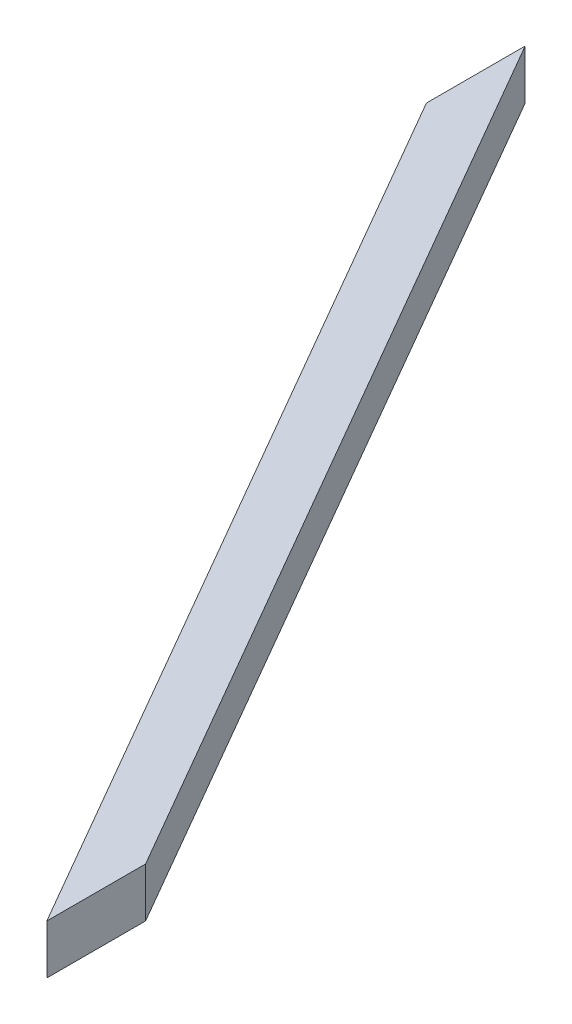
ISO-10303-21;
HEADER;
FILE_DESCRIPTION(('STEP AP214'),'2;1');
FILE_NAME('part.step','',(''),(''),'','','');
FILE_SCHEMA(('AUTOMOTIVE_DESIGN { 1 0 10303 214 1 1 1 1 }'));
ENDSEC;
DATA;
#1=APPLICATION_CONTEXT('core data for automotive mechanical design processes');
#2=APPLICATION_PROTOCOL_DEFINITION('international standard','automotive_design',2000,#1);
#3=PRODUCT_CONTEXT('',#1,'mechanical');
#4=PRODUCT('Part','Part','',(#3));
#5=PRODUCT_RELATED_PRODUCT_CATEGORY('part','',(#4));
#6=PRODUCT_DEFINITION_FORMATION('','',#4);
#7=PRODUCT_DEFINITION_CONTEXT('part definition',#1,'design');
#8=PRODUCT_DEFINITION('design','',#6,#7);
#9=PRODUCT_DEFINITION_SHAPE('','',#8);
#10=(LENGTH_UNIT() NAMED_UNIT(*) SI_UNIT(.MILLI.,.METRE.));
#11=(NAMED_UNIT(*) PLANE_ANGLE_UNIT() SI_UNIT($,.RADIAN.));
#12=(NAMED_UNIT(*) SI_UNIT($,.STERADIAN.) SOLID_ANGLE_UNIT());
#13=UNCERTAINTY_MEASURE_WITH_UNIT(LENGTH_MEASURE(1.E-05),#10,'distance_accuracy_value','');
#14=(GEOMETRIC_REPRESENTATION_CONTEXT(3) GLOBAL_UNCERTAINTY_ASSIGNED_CONTEXT((#13)) GLOBAL_UNIT_ASSIGNED_CONTEXT((#10,
#11,#12)) REPRESENTATION_CONTEXT('',''));
#15=CARTESIAN_POINT('',(0.,0.,0.));
#16=DIRECTION('',(0.,0.,1.));
#17=DIRECTION('',(1.,0.,0.));
#18=AXIS2_PLACEMENT_3D('',#15,#16,#17);
#19=CARTESIAN_POINT('',(-100.,20.,239.999999999999));
#20=DIRECTION('',(0.866025403784435,0.,-0.500000000000006));
#21=DIRECTION('',(-0.500000000000006,0.,-0.866025403784435));
#22=AXIS2_PLACEMENT_3D('',#19,#20,#21);
#23=PLANE('',#22);
#24=DIRECTION('',(0.500000000000006,0.,0.866025403784435));
#25=VECTOR('',#24,1.);
#26=CARTESIAN_POINT('',(-100.,0.,239.999999999999));
#27=LINE('',#26,#25);
#28=CARTESIAN_POINT('',(-100.,0.,239.999999999999));
#29=VERTEX_POINT('',#28);
#30=CARTESIAN_POINT('',(110.000000000002,0.,603.730669589462));
#31=VERTEX_POINT('',#30);
#32=EDGE_CURVE('E107',#29,#31,#27,.T.);
#33=ORIENTED_EDGE('',*,*,#32,.T.);
#34=DIRECTION('',(0.,-1.,0.));
#35=VECTOR('',#34,1.);
#36=CARTESIAN_POINT('',(110.000000000002,20.,603.730669589462));
#37=LINE('',#36,#35);
#38=CARTESIAN_POINT('',(110.000000000002,20.,603.730669589462));
#39=VERTEX_POINT('',#38);
#40=EDGE_CURVE('E11',#39,#31,#37,.T.);
#41=ORIENTED_EDGE('',*,*,#40,.F.);
#42=DIRECTION('',(0.500000000000006,0.,0.866025403784435));
#43=VECTOR('',#42,1.);
#44=CARTESIAN_POINT('',(-100.,20.,239.999999999999));
#45=LINE('',#44,#43);
#46=CARTESIAN_POINT('',(-100.,20.,239.999999999999));
#47=VERTEX_POINT('',#46);
#48=EDGE_CURVE('E91',#47,#39,#45,.T.);
#49=ORIENTED_EDGE('',*,*,#48,.F.);
#50=DIRECTION('',(0.,-1.,0.));
#51=VECTOR('',#50,1.);
#52=CARTESIAN_POINT('',(-100.,20.,239.999999999999));
#53=LINE('',#52,#51);
#54=EDGE_CURVE('E103',#47,#29,#53,.T.);
#55=ORIENTED_EDGE('',*,*,#54,.T.);
#56=EDGE_LOOP('',(#33,#41,#49,#55));
#57=FACE_BOUND('',#56,.T.);
#58=ADVANCED_FACE('F39',(#57),#23,.F.);
#59=CARTESIAN_POINT('',(110.000000000002,20.,603.730669589462));
#60=DIRECTION('',(-1.,0.,0.));
#61=DIRECTION('',(0.,0.,1.));
#62=AXIS2_PLACEMENT_3D('',#59,#60,#61);
#63=PLANE('',#62);
#64=DIRECTION('',(0.,0.,-1.));
#65=VECTOR('',#64,1.);
#66=CARTESIAN_POINT('',(110.000000000002,0.,603.730669589462));
#67=LINE('',#66,#65);
#68=CARTESIAN_POINT('',(110.000000000002,0.,563.730669589463));
#69=VERTEX_POINT('',#68);
#70=EDGE_CURVE('E96',#31,#69,#67,.T.);
#71=ORIENTED_EDGE('',*,*,#70,.T.);
#72=DIRECTION('',(0.,-1.,0.));
#73=VECTOR('',#72,1.);
#74=CARTESIAN_POINT('',(110.000000000002,20.,563.730669589463));
#75=LINE('',#74,#73);
#76=CARTESIAN_POINT('',(110.000000000002,20.,563.730669589463));
#77=VERTEX_POINT('',#76);
#78=EDGE_CURVE('E48',#77,#69,#75,.T.);
#79=ORIENTED_EDGE('',*,*,#78,.F.);
#80=DIRECTION('',(0.,0.,-1.));
#81=VECTOR('',#80,1.);
#82=CARTESIAN_POINT('',(110.000000000002,20.,603.730669589462));
#83=LINE('',#82,#81);
#84=EDGE_CURVE('E86',#39,#77,#83,.T.);
#85=ORIENTED_EDGE('',*,*,#84,.F.);
#86=ORIENTED_EDGE('',*,*,#40,.T.);
#87=EDGE_LOOP('',(#71,#79,#85,#86));
#88=FACE_BOUND('',#87,.T.);
#89=ADVANCED_FACE('F95',(#88),#63,.F.);
#90=CARTESIAN_POINT('',(110.000000000002,20.,563.730669589463));
#91=DIRECTION('',(-0.866025403784435,0.,0.500000000000006));
#92=DIRECTION('',(0.500000000000006,0.,0.866025403784435));
#93=AXIS2_PLACEMENT_3D('',#90,#91,#92);
#94=PLANE('',#93);
#95=DIRECTION('',(-0.500000000000006,0.,-0.866025403784435));
#96=VECTOR('',#95,1.);
#97=CARTESIAN_POINT('',(110.000000000002,0.,563.730669589463));
#98=LINE('',#97,#96);
#99=CARTESIAN_POINT('',(-100.,0.,200.));
#100=VERTEX_POINT('',#99);
#101=EDGE_CURVE('E73',#69,#100,#98,.T.);
#102=ORIENTED_EDGE('',*,*,#101,.T.);
#103=DIRECTION('',(0.,-1.,0.));
#104=VECTOR('',#103,1.);
#105=CARTESIAN_POINT('',(-100.,20.,200.));
#106=LINE('',#105,#104);
#107=CARTESIAN_POINT('',(-100.,20.,200.));
#108=VERTEX_POINT('',#107);
#109=EDGE_CURVE('E98',#108,#100,#106,.T.);
#110=ORIENTED_EDGE('',*,*,#109,.F.);
#111=DIRECTION('',(-0.500000000000006,0.,-0.866025403784435));
#112=VECTOR('',#111,1.);
#113=CARTESIAN_POINT('',(110.000000000002,20.,563.730669589463));
#114=LINE('',#113,#112);
#115=EDGE_CURVE('E89',#77,#108,#114,.T.);
#116=ORIENTED_EDGE('',*,*,#115,.F.);
#117=ORIENTED_EDGE('',*,*,#78,.T.);
#118=EDGE_LOOP('',(#102,#110,#116,#117));
#119=FACE_BOUND('',#118,.T.);
#120=ADVANCED_FACE('F99',(#119),#94,.F.);
#121=CARTESIAN_POINT('',(-100.,20.,200.));
#122=DIRECTION('',(1.,0.,0.));
#123=DIRECTION('',(0.,0.,-1.));
#124=AXIS2_PLACEMENT_3D('',#121,#122,#123);
#125=PLANE('',#124);
#126=DIRECTION('',(0.,0.,1.));
#127=VECTOR('',#126,1.);
#128=CARTESIAN_POINT('',(-100.,0.,200.));
#129=LINE('',#128,#127);
#130=EDGE_CURVE('E79',#100,#29,#129,.T.);
#131=ORIENTED_EDGE('',*,*,#130,.T.);
#132=ORIENTED_EDGE('',*,*,#54,.F.);
#133=DIRECTION('',(0.,0.,1.));
#134=VECTOR('',#133,1.);
#135=CARTESIAN_POINT('',(-100.,20.,200.));
#136=LINE('',#135,#134);
#137=EDGE_CURVE('E56',#108,#47,#136,.T.);
#138=ORIENTED_EDGE('',*,*,#137,.F.);
#139=ORIENTED_EDGE('',*,*,#109,.T.);
#140=EDGE_LOOP('',(#131,#132,#138,#139));
#141=FACE_BOUND('',#140,.T.);
#142=ADVANCED_FACE('F120',(#141),#125,.F.);
#143=CARTESIAN_POINT('',(0.,20.,0.));
#144=DIRECTION('',(0.,1.,0.));
#145=DIRECTION('',(0.,0.,1.));
#146=AXIS2_PLACEMENT_3D('',#143,#144,#145);
#147=PLANE('',#146);
#148=ORIENTED_EDGE('',*,*,#48,.T.);
#149=ORIENTED_EDGE('',*,*,#84,.T.);
#150=ORIENTED_EDGE('',*,*,#115,.T.);
#151=ORIENTED_EDGE('',*,*,#137,.T.);
#152=EDGE_LOOP('',(#148,#149,#150,#151));
#153=FACE_BOUND('',#152,.T.);
#154=ADVANCED_FACE('F87',(#153),#147,.T.);
#155=CARTESIAN_POINT('',(0.,0.,0.));
#156=DIRECTION('',(0.,1.,0.));
#157=DIRECTION('',(0.,0.,1.));
#158=AXIS2_PLACEMENT_3D('',#155,#156,#157);
#159=PLANE('',#158);
#160=ORIENTED_EDGE('',*,*,#32,.F.);
#161=ORIENTED_EDGE('',*,*,#130,.F.);
#162=ORIENTED_EDGE('',*,*,#101,.F.);
#163=ORIENTED_EDGE('',*,*,#70,.F.);
#164=EDGE_LOOP('',(#160,#161,#162,#163));
#165=FACE_BOUND('',#164,.T.);
#166=ADVANCED_FACE('F123',(#165),#159,.F.);
#167=CLOSED_SHELL('',(#58,#89,#120,#142,#154,#166));
#168=MANIFOLD_SOLID_BREP('B2',#167);
#169=ADVANCED_BREP_SHAPE_REPRESENTATION('',(#18,#168),#14);
#170=SHAPE_DEFINITION_REPRESENTATION(#9,#169);
ENDSEC;
END-ISO-10303-21;
